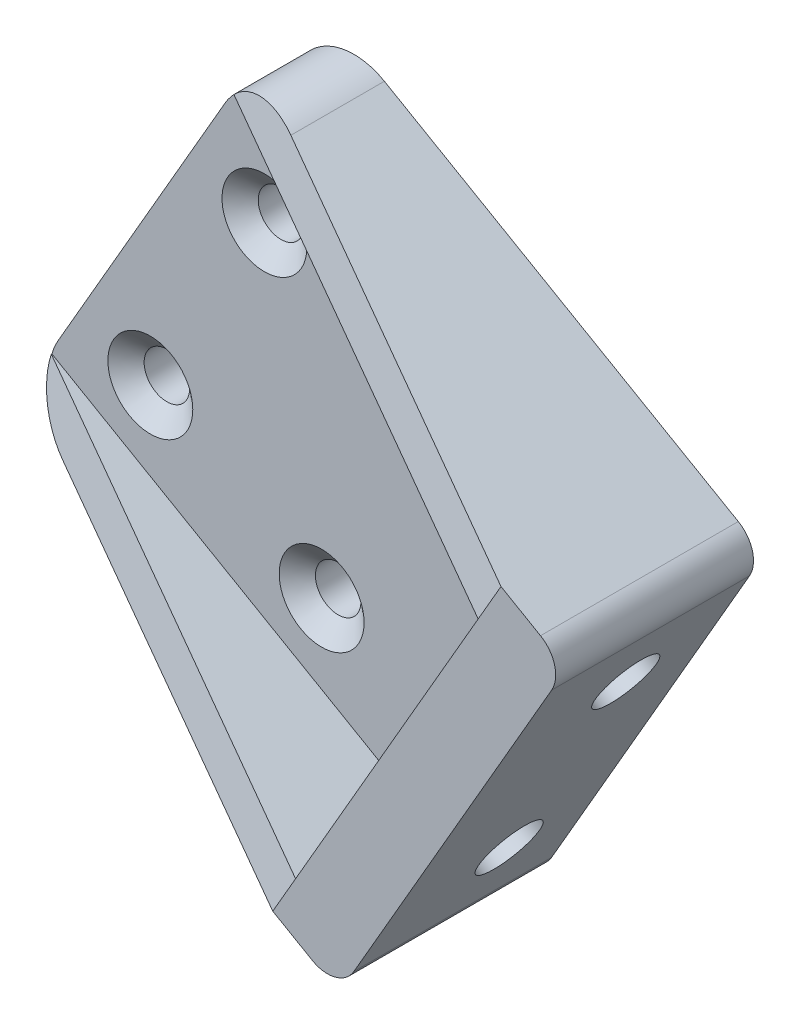
ISO-10303-21;
HEADER;
FILE_DESCRIPTION(('STEP AP214'),'2;1');
FILE_NAME('part.step','',(''),(''),'','','');
FILE_SCHEMA(('AUTOMOTIVE_DESIGN { 1 0 10303 214 1 1 1 1 }'));
ENDSEC;
DATA;
#1=APPLICATION_CONTEXT('core data for automotive mechanical design processes');
#2=APPLICATION_PROTOCOL_DEFINITION('international standard','automotive_design',2000,#1);
#3=PRODUCT_CONTEXT('',#1,'mechanical');
#4=PRODUCT('Part','Part','',(#3));
#5=PRODUCT_RELATED_PRODUCT_CATEGORY('part','',(#4));
#6=PRODUCT_DEFINITION_FORMATION('','',#4);
#7=PRODUCT_DEFINITION_CONTEXT('part definition',#1,'design');
#8=PRODUCT_DEFINITION('design','',#6,#7);
#9=PRODUCT_DEFINITION_SHAPE('','',#8);
#10=(LENGTH_UNIT() NAMED_UNIT(*) SI_UNIT(.MILLI.,.METRE.));
#11=(NAMED_UNIT(*) PLANE_ANGLE_UNIT() SI_UNIT($,.RADIAN.));
#12=(NAMED_UNIT(*) SI_UNIT($,.STERADIAN.) SOLID_ANGLE_UNIT());
#13=UNCERTAINTY_MEASURE_WITH_UNIT(LENGTH_MEASURE(1.E-05),#10,'distance_accuracy_value','');
#14=(GEOMETRIC_REPRESENTATION_CONTEXT(3) GLOBAL_UNCERTAINTY_ASSIGNED_CONTEXT((#13)) GLOBAL_UNIT_ASSIGNED_CONTEXT((#10,
#11,#12)) REPRESENTATION_CONTEXT('',''));
#15=CARTESIAN_POINT('',(0.,0.,0.));
#16=DIRECTION('',(0.,0.,1.));
#17=DIRECTION('',(1.,0.,0.));
#18=AXIS2_PLACEMENT_3D('',#15,#16,#17);
#19=CARTESIAN_POINT('',(49.669607592428,-6.67971605790583,6.35));
#20=DIRECTION('',(0.866025403784439,-0.499999999999999,0.));
#21=DIRECTION('',(0.5,0.866025403784439,0.));
#22=AXIS2_PLACEMENT_3D('',#19,#20,#21);
#23=PLANE('',#22);
#24=DIRECTION('',(-0.499999999999999,-0.866025403784439,0.));
#25=VECTOR('',#24,1.);
#26=CARTESIAN_POINT('',(49.669607592428,-6.67971605790583,6.35));
#27=LINE('',#26,#25);
#28=CARTESIAN_POINT('',(47.129607592428,-11.0791251091308,6.35));
#29=VERTEX_POINT('',#28);
#30=CARTESIAN_POINT('',(33.159607592428,-35.275874890868,6.35));
#31=VERTEX_POINT('',#30);
#32=EDGE_CURVE('E250',#29,#31,#27,.T.);
#33=ORIENTED_EDGE('',*,*,#32,.F.);
#34=DIRECTION('',(0.,0.,-1.));
#35=VECTOR('',#34,1.);
#36=CARTESIAN_POINT('',(47.129607592428,-11.0791251091308,6.35));
#37=LINE('',#36,#35);
#38=CARTESIAN_POINT('',(47.129607592428,-11.0791251091308,0.));
#39=VERTEX_POINT('',#38);
#40=EDGE_CURVE('E184',#29,#39,#37,.T.);
#41=ORIENTED_EDGE('',*,*,#40,.T.);
#42=DIRECTION('',(-0.499999999999999,-0.866025403784439,0.));
#43=VECTOR('',#42,1.);
#44=CARTESIAN_POINT('',(49.669607592428,-6.67971605790583,0.));
#45=LINE('',#44,#43);
#46=CARTESIAN_POINT('',(33.159607592428,-35.275874890868,0.));
#47=VERTEX_POINT('',#46);
#48=EDGE_CURVE('E252',#39,#47,#45,.T.);
#49=ORIENTED_EDGE('',*,*,#48,.T.);
#50=DIRECTION('',(0.,0.,-1.));
#51=VECTOR('',#50,1.);
#52=CARTESIAN_POINT('',(33.159607592428,-35.275874890868,6.35));
#53=LINE('',#52,#51);
#54=EDGE_CURVE('E179',#47,#31,#53,.F.);
#55=ORIENTED_EDGE('',*,*,#54,.T.);
#56=EDGE_LOOP('',(#33,#41,#49,#55));
#57=FACE_BOUND('',#56,.T.);
#58=ADVANCED_FACE('F33',(#57),#23,.F.);
#59=CARTESIAN_POINT('',(30.619607592428,-39.675283942093,6.35));
#60=DIRECTION('',(0.5,0.866025403784439,0.));
#61=DIRECTION('',(-0.866025403784439,0.5,0.));
#62=AXIS2_PLACEMENT_3D('',#59,#60,#61);
#63=PLANE('',#62);
#64=DIRECTION('',(0.866025403784439,-0.5,0.));
#65=VECTOR('',#64,1.);
#66=CARTESIAN_POINT('',(30.619607592428,-39.675283942093,0.));
#67=LINE('',#66,#65);
#68=CARTESIAN_POINT('',(35.019016643653,-42.215283942093,0.));
#69=VERTEX_POINT('',#68);
#70=CARTESIAN_POINT('',(64.5610484226282,-59.2713839420928,0.));
#71=VERTEX_POINT('',#70);
#72=EDGE_CURVE('E248',#69,#71,#67,.T.);
#73=ORIENTED_EDGE('',*,*,#72,.T.);
#74=DIRECTION('',(0.,0.,-1.));
#75=VECTOR('',#74,1.);
#76=CARTESIAN_POINT('',(64.5610484226282,-59.2713839420928,6.35));
#77=LINE('',#76,#75);
#78=CARTESIAN_POINT('',(64.5610484226282,-59.2713839420928,16.51));
#79=VERTEX_POINT('',#78);
#80=EDGE_CURVE('E11',#71,#79,#77,.F.);
#81=ORIENTED_EDGE('',*,*,#80,.T.);
#82=DIRECTION('',(0.86602540378444,-0.499999999999998,0.));
#83=VECTOR('',#82,1.);
#84=CARTESIAN_POINT('',(61.2614916342095,-57.3663839420928,16.51));
#85=LINE('',#84,#83);
#86=CARTESIAN_POINT('',(61.2614916342095,-57.3663839420928,16.51));
#87=VERTEX_POINT('',#86);
#88=EDGE_CURVE('E348',#87,#79,#85,.T.);
#89=ORIENTED_EDGE('',*,*,#88,.F.);
#90=DIRECTION('',(0.832387744943736,-0.480579288613411,0.275996719950274));
#91=VECTOR('',#90,1.);
#92=CARTESIAN_POINT('',(30.6196075924273,-39.6752839420942,6.35));
#93=LINE('',#92,#91);
#94=CARTESIAN_POINT('',(35.0190166436523,-42.2152839420942,7.80872218234029));
#95=VERTEX_POINT('',#94);
#96=EDGE_CURVE('E364',#95,#87,#93,.T.);
#97=ORIENTED_EDGE('',*,*,#96,.F.);
#98=DIRECTION('',(0.,0.,-1.));
#99=VECTOR('',#98,1.);
#100=CARTESIAN_POINT('',(35.019016643653,-42.215283942093,6.35));
#101=LINE('',#100,#99);
#102=EDGE_CURVE('E202',#95,#69,#101,.T.);
#103=ORIENTED_EDGE('',*,*,#102,.T.);
#104=EDGE_LOOP('',(#73,#81,#89,#97,#103));
#105=FACE_BOUND('',#104,.T.);
#106=ADVANCED_FACE('F321',(#105),#63,.F.);
#107=CARTESIAN_POINT('',(85.8107529482407,-27.5458160579057,6.35));
#108=DIRECTION('',(-0.866025403784439,0.5,0.));
#109=DIRECTION('',(-0.5,-0.866025403784439,0.));
#110=AXIS2_PLACEMENT_3D('',#107,#108,#109);
#111=PLANE('',#110);
#112=CARTESIAN_POINT('',(81.1522967470904,-35.6144988831323,6.93730614945245));
#113=DIRECTION('',(0.866025403784438,-0.5,0.));
#114=DIRECTION('',(0.5,0.866025403784438,0.));
#115=AXIS2_PLACEMENT_3D('',#112,#113,#114);
#116=CIRCLE('',#115,2.54999999999999);
#117=CARTESIAN_POINT('',(82.4272967470904,-33.406134103482,6.93730614945245));
#118=VERTEX_POINT('',#117);
#119=EDGE_CURVE('E170',#118,#118,#116,.T.);
#120=ORIENTED_EDGE('',*,*,#119,.F.);
#121=EDGE_LOOP('',(#120));
#122=FACE_BOUND('',#121,.T.);
#123=CARTESIAN_POINT('',(71.4192091493911,-52.472701116866,6.93730614945245));
#124=DIRECTION('',(0.866025403784438,-0.5,0.));
#125=DIRECTION('',(0.5,0.866025403784438,0.));
#126=AXIS2_PLACEMENT_3D('',#123,#124,#125);
#127=CIRCLE('',#126,2.54999999999999);
#128=CARTESIAN_POINT('',(72.6942091493911,-50.2643363372157,6.93730614945245));
#129=VERTEX_POINT('',#128);
#130=EDGE_CURVE('E169',#129,#129,#127,.T.);
#131=ORIENTED_EDGE('',*,*,#130,.F.);
#132=EDGE_LOOP('',(#131));
#133=FACE_BOUND('',#132,.T.);
#134=DIRECTION('',(0.5,0.866025403784439,0.));
#135=VECTOR('',#134,1.);
#136=CARTESIAN_POINT('',(85.8107529482407,-27.5458160579057,0.));
#137=LINE('',#136,#135);
#138=CARTESIAN_POINT('',(68.0307529482407,-58.3416794164803,0.));
#139=VERTEX_POINT('',#138);
#140=CARTESIAN_POINT('',(84.5407529482407,-29.7455205835181,0.));
#141=VERTEX_POINT('',#140);
#142=EDGE_CURVE('E244',#139,#141,#137,.T.);
#143=ORIENTED_EDGE('',*,*,#142,.T.);
#144=DIRECTION('',(0.,0.,-1.));
#145=VECTOR('',#144,1.);
#146=CARTESIAN_POINT('',(84.5407529482407,-29.7455205835181,6.35));
#147=LINE('',#146,#145);
#148=CARTESIAN_POINT('',(84.5407529482407,-29.7455205835181,16.51));
#149=VERTEX_POINT('',#148);
#150=EDGE_CURVE('E54',#141,#149,#147,.F.);
#151=ORIENTED_EDGE('',*,*,#150,.T.);
#152=DIRECTION('',(0.5,0.866025403784439,0.));
#153=VECTOR('',#152,1.);
#154=CARTESIAN_POINT('',(66.7607529482407,-60.5413839420928,16.51));
#155=LINE('',#154,#153);
#156=CARTESIAN_POINT('',(68.0307529482407,-58.3416794164803,16.51));
#157=VERTEX_POINT('',#156);
#158=EDGE_CURVE('E228',#157,#149,#155,.T.);
#159=ORIENTED_EDGE('',*,*,#158,.F.);
#160=DIRECTION('',(0.,0.,-1.));
#161=VECTOR('',#160,1.);
#162=CARTESIAN_POINT('',(68.0307529482407,-58.3416794164803,6.35));
#163=LINE('',#162,#161);
#164=EDGE_CURVE('E216',#157,#139,#163,.T.);
#165=ORIENTED_EDGE('',*,*,#164,.T.);
#166=EDGE_LOOP('',(#143,#151,#159,#165));
#167=FACE_BOUND('',#166,.T.);
#168=ADVANCED_FACE('F246',(#122,#133,#167),#111,.F.);
#169=CARTESIAN_POINT('',(49.669607592428,-6.67971605790583,6.35));
#170=DIRECTION('',(-0.5,-0.866025403784439,0.));
#171=DIRECTION('',(0.866025403784439,-0.5,0.));
#172=AXIS2_PLACEMENT_3D('',#169,#170,#171);
#173=PLANE('',#172);
#174=DIRECTION('',(-0.866025403784439,0.5,0.));
#175=VECTOR('',#174,1.);
#176=CARTESIAN_POINT('',(85.8107529482407,-27.5458160579057,16.51));
#177=LINE('',#176,#175);
#178=CARTESIAN_POINT('',(83.6110484226282,-26.2758160579057,16.51));
#179=VERTEX_POINT('',#178);
#180=CARTESIAN_POINT('',(80.3114916342095,-24.3708160579057,16.51));
#181=VERTEX_POINT('',#180);
#182=EDGE_CURVE('E226',#179,#181,#177,.T.);
#183=ORIENTED_EDGE('',*,*,#182,.F.);
#184=DIRECTION('',(0.,0.,-1.));
#185=VECTOR('',#184,1.);
#186=CARTESIAN_POINT('',(83.6110484226282,-26.2758160579057,6.35));
#187=LINE('',#186,#185);
#188=CARTESIAN_POINT('',(83.6110484226282,-26.2758160579057,0.));
#189=VERTEX_POINT('',#188);
#190=EDGE_CURVE('E209',#179,#189,#187,.T.);
#191=ORIENTED_EDGE('',*,*,#190,.T.);
#192=DIRECTION('',(-0.866025403784439,0.5,0.));
#193=VECTOR('',#192,1.);
#194=CARTESIAN_POINT('',(49.669607592428,-6.67971605790583,0.));
#195=LINE('',#194,#193);
#196=CARTESIAN_POINT('',(54.069016643653,-9.21971605790583,0.));
#197=VERTEX_POINT('',#196);
#198=EDGE_CURVE('E245',#189,#197,#195,.T.);
#199=ORIENTED_EDGE('',*,*,#198,.T.);
#200=DIRECTION('',(0.,0.,-1.));
#201=VECTOR('',#200,1.);
#202=CARTESIAN_POINT('',(54.069016643653,-9.21971605790583,6.35));
#203=LINE('',#202,#201);
#204=CARTESIAN_POINT('',(54.069016643653,-9.21971605790582,7.80872218234029));
#205=VERTEX_POINT('',#204);
#206=EDGE_CURVE('E192',#197,#205,#203,.F.);
#207=ORIENTED_EDGE('',*,*,#206,.T.);
#208=DIRECTION('',(0.832387744943736,-0.480579288613411,0.275996719950274));
#209=VECTOR('',#208,1.);
#210=CARTESIAN_POINT('',(49.669607592428,-6.67971605790581,6.35));
#211=LINE('',#210,#209);
#212=EDGE_CURVE('E235',#205,#181,#211,.T.);
#213=ORIENTED_EDGE('',*,*,#212,.T.);
#214=EDGE_LOOP('',(#183,#191,#199,#207,#213));
#215=FACE_BOUND('',#214,.T.);
#216=ADVANCED_FACE('F232',(#215),#173,.F.);
#217=CARTESIAN_POINT('',(0.,0.,6.35));
#218=DIRECTION('',(0.,0.,1.));
#219=DIRECTION('',(1.,0.,0.));
#220=AXIS2_PLACEMENT_3D('',#217,#218,#219);
#221=PLANE('',#220);
#222=CARTESIAN_POINT('',(40.8813689064592,-34.6013919710462,6.35));
#223=DIRECTION('',(0.,0.,1.));
#224=DIRECTION('',(1.,0.,0.));
#225=AXIS2_PLACEMENT_3D('',#222,#223,#224);
#226=CIRCLE('',#225,3.5433);
#227=CARTESIAN_POINT('',(44.4246689064592,-34.6013919710462,6.35));
#228=VERTEX_POINT('',#227);
#229=EDGE_CURVE('E412',#228,#228,#226,.T.);
#230=ORIENTED_EDGE('',*,*,#229,.F.);
#231=EDGE_LOOP('',(#230));
#232=FACE_BOUND('',#231,.T.);
#233=CARTESIAN_POINT('',(50.4063689064592,-18.1036080289526,6.35));
#234=DIRECTION('',(0.,0.,1.));
#235=DIRECTION('',(1.,0.,0.));
#236=AXIS2_PLACEMENT_3D('',#233,#234,#235);
#237=CIRCLE('',#236,3.5433);
#238=CARTESIAN_POINT('',(53.9496689064592,-18.1036080289526,6.35));
#239=VERTEX_POINT('',#238);
#240=EDGE_CURVE('E403',#239,#239,#237,.T.);
#241=ORIENTED_EDGE('',*,*,#240,.F.);
#242=EDGE_LOOP('',(#241));
#243=FACE_BOUND('',#242,.T.);
#244=CARTESIAN_POINT('',(64.7044483229403,-26.3586080289526,6.35));
#245=DIRECTION('',(0.,0.,1.));
#246=DIRECTION('',(1.,0.,0.));
#247=AXIS2_PLACEMENT_3D('',#244,#245,#246);
#248=CIRCLE('',#247,3.5433);
#249=CARTESIAN_POINT('',(68.2477483229403,-26.3586080289526,6.35));
#250=VERTEX_POINT('',#249);
#251=EDGE_CURVE('E394',#250,#250,#248,.T.);
#252=ORIENTED_EDGE('',*,*,#251,.F.);
#253=EDGE_LOOP('',(#252));
#254=FACE_BOUND('',#253,.T.);
#255=CARTESIAN_POINT('',(55.1794483229403,-42.8563919710462,6.35));
#256=DIRECTION('',(0.,0.,1.));
#257=DIRECTION('',(1.,0.,0.));
#258=AXIS2_PLACEMENT_3D('',#255,#256,#257);
#259=CIRCLE('',#258,3.5433);
#260=CARTESIAN_POINT('',(58.7227483229403,-42.8563919710462,6.35));
#261=VERTEX_POINT('',#260);
#262=EDGE_CURVE('E385',#261,#261,#259,.T.);
#263=ORIENTED_EDGE('',*,*,#262,.F.);
#264=EDGE_LOOP('',(#263));
#265=FACE_BOUND('',#264,.T.);
#266=DIRECTION('',(-0.866025403784439,0.5,0.));
#267=VECTOR('',#266,1.);
#268=CARTESIAN_POINT('',(78.4064916342095,-27.6703728463244,6.35));
#269=LINE('',#268,#267);
#270=CARTESIAN_POINT('',(78.4064916342095,-27.6703728463244,6.35));
#271=VERTEX_POINT('',#270);
#272=CARTESIAN_POINT('',(47.9043071465159,-10.0599284214828,6.35));
#273=VERTEX_POINT('',#272);
#274=EDGE_CURVE('E354',#271,#273,#269,.T.);
#275=ORIENTED_EDGE('',*,*,#274,.T.);
#276=CARTESIAN_POINT('',(51.529016643653,-13.6191251091308,6.35));
#277=DIRECTION('',(0.,0.,1.));
#278=DIRECTION('',(1.,0.,0.));
#279=AXIS2_PLACEMENT_3D('',#276,#277,#278);
#280=CIRCLE('',#279,5.08);
#281=EDGE_CURVE('E200',#273,#29,#280,.T.);
#282=ORIENTED_EDGE('',*,*,#281,.T.);
#283=ORIENTED_EDGE('',*,*,#32,.T.);
#284=CARTESIAN_POINT('',(37.559016643653,-37.815874890868,6.35));
#285=DIRECTION('',(0.,0.,1.));
#286=DIRECTION('',(1.,0.,0.));
#287=AXIS2_PLACEMENT_3D('',#284,#285,#286);
#288=CIRCLE('',#287,5.08);
#289=CARTESIAN_POINT('',(32.6643071465155,-36.456382728834,6.35));
#290=VERTEX_POINT('',#289);
#291=EDGE_CURVE('E198',#31,#290,#288,.T.);
#292=ORIENTED_EDGE('',*,*,#291,.T.);
#293=DIRECTION('',(-0.866025403784439,0.499999999999999,0.));
#294=VECTOR('',#293,1.);
#295=CARTESIAN_POINT('',(63.1664916342088,-54.0668271536753,6.35));
#296=LINE('',#295,#294);
#297=CARTESIAN_POINT('',(63.1664916342088,-54.0668271536753,6.35));
#298=VERTEX_POINT('',#297);
#299=EDGE_CURVE('E366',#298,#290,#296,.T.);
#300=ORIENTED_EDGE('',*,*,#299,.F.);
#301=DIRECTION('',(-0.5,-0.866025403784439,0.));
#302=VECTOR('',#301,1.);
#303=CARTESIAN_POINT('',(80.3114916342095,-24.3708160579057,6.35));
#304=LINE('',#303,#302);
#305=CARTESIAN_POINT('',(64.6792251138368,-51.4466959086492,6.35));
#306=VERTEX_POINT('',#305);
#307=EDGE_CURVE('E259',#306,#298,#304,.T.);
#308=ORIENTED_EDGE('',*,*,#307,.F.);
#309=DIRECTION('',(0.866025403784438,-0.5,0.));
#310=VECTOR('',#309,1.);
#311=CARTESIAN_POINT('',(70.178486427868,-54.6216959086492,6.35));
#312=LINE('',#311,#310);
#313=CARTESIAN_POINT('',(63.139431945908,-50.5576959086492,6.35));
#314=VERTEX_POINT('',#313);
#315=EDGE_CURVE('E454',#314,#306,#312,.T.);
#316=ORIENTED_EDGE('',*,*,#315,.F.);
#317=CARTESIAN_POINT('',(63.1645679482118,-52.8922918588002,6.35));
#318=CARTESIAN_POINT('',(63.1616679257406,-52.6800356568973,6.35));
#319=CARTESIAN_POINT('',(63.1588418076062,-52.4677782200947,6.35));
#320=CARTESIAN_POINT('',(63.1534756416226,-52.0432536983283,6.35));
#321=CARTESIAN_POINT('',(63.1509356019462,-51.8309866132622,6.35));
#322=CARTESIAN_POINT('',(63.1462735163987,-51.4058532261958,6.35));
#323=CARTESIAN_POINT('',(63.1441526611504,-51.1929869110068,6.35));
#324=CARTESIAN_POINT('',(63.1406152358189,-50.7672520545871,6.35));
#325=CARTESIAN_POINT('',(63.1391986511281,-50.5543835134941,6.35));
#326=CARTESIAN_POINT('',(63.1380519571835,-50.2302987364304,6.35));
#327=CARTESIAN_POINT('',(63.1378395281479,-50.1190843446111,6.35));
#328=CARTESIAN_POINT('',(63.1379532662041,-49.896650850708,6.35));
#329=CARTESIAN_POINT('',(63.1382794549127,-49.7854317486143,6.35));
#330=CARTESIAN_POINT('',(63.1397596180906,-49.563170276895,6.35));
#331=CARTESIAN_POINT('',(63.140912315456,-49.4521278991772,6.35));
#332=CARTESIAN_POINT('',(63.1445590952118,-49.230071083183,6.35));
#333=CARTESIAN_POINT('',(63.147053044837,-49.1190566432292,6.35));
#334=CARTESIAN_POINT('',(63.1528125250689,-48.9473836643378,6.35));
#335=CARTESIAN_POINT('',(63.1552166184551,-48.8866972206919,6.35));
#336=CARTESIAN_POINT('',(63.1611082694497,-48.7653772306634,6.35));
#337=CARTESIAN_POINT('',(63.1645957642583,-48.7047436814189,6.35));
#338=CARTESIAN_POINT('',(63.1732237397579,-48.5832872684547,6.35));
#339=CARTESIAN_POINT('',(63.1783723664431,-48.5224649658429,6.35));
#340=CARTESIAN_POINT('',(63.1912619461898,-48.4010907034475,6.35));
#341=CARTESIAN_POINT('',(63.199001936221,-48.3405386516891,6.35));
#342=CARTESIAN_POINT('',(63.2146262829362,-48.2453274617159,6.35));
#343=CARTESIAN_POINT('',(63.2210936980291,-48.2104408242378,6.35));
#344=CARTESIAN_POINT('',(63.2359774482342,-48.1410679476839,6.35));
#345=CARTESIAN_POINT('',(63.2443941144869,-48.1065817776865,6.35));
#346=CARTESIAN_POINT('',(63.2636452142718,-48.0387180704494,6.35));
#347=CARTESIAN_POINT('',(63.274449616812,-48.0053322166489,6.35));
#348=CARTESIAN_POINT('',(63.2990797944048,-47.9397078819447,6.35));
#349=CARTESIAN_POINT('',(63.3129028394686,-47.9074683947323,6.35));
#350=CARTESIAN_POINT('',(63.3441276349603,-47.8441366271014,6.35));
#351=CARTESIAN_POINT('',(63.3615814285247,-47.8130698018702,6.35));
#352=CARTESIAN_POINT('',(63.3997706641609,-47.7530267676438,6.35));
#353=CARTESIAN_POINT('',(63.4205065881184,-47.7240508665512,6.35));
#354=CARTESIAN_POINT('',(63.464943796009,-47.6679141851395,6.35));
#355=CARTESIAN_POINT('',(63.4886783410867,-47.6407800367338,6.35));
#356=CARTESIAN_POINT('',(63.5382004409967,-47.5884644859748,6.35));
#357=CARTESIAN_POINT('',(63.5639887523087,-47.5632838099642,6.35));
#358=CARTESIAN_POINT('',(63.6341220344498,-47.4987363368604,6.35));
#359=CARTESIAN_POINT('',(63.6796922777454,-47.4607141696201,6.35));
#360=CARTESIAN_POINT('',(63.7729995039603,-47.387402760729,6.35));
#361=CARTESIAN_POINT('',(63.8207388169422,-47.3521165737415,6.35));
#362=CARTESIAN_POINT('',(63.9175892072953,-47.2832347791605,6.35));
#363=CARTESIAN_POINT('',(63.9667033558369,-47.2496435202203,6.35));
#364=CARTESIAN_POINT('',(64.0657163069662,-47.1836331372578,6.35));
#365=CARTESIAN_POINT('',(64.1156152201987,-47.1512141806844,6.35));
#366=CARTESIAN_POINT('',(64.2163360176048,-47.0869150591158,6.35));
#367=CARTESIAN_POINT('',(64.2671621177585,-47.0550415213311,6.35));
#368=CARTESIAN_POINT('',(64.3691713551072,-46.9918700323968,6.35));
#369=CARTESIAN_POINT('',(64.4203545010947,-46.9605720954913,6.35));
#370=CARTESIAN_POINT('',(64.5740828184515,-46.8674131570285,6.35));
#371=CARTESIAN_POINT('',(64.6769994209463,-46.8061660850304,6.35));
#372=CARTESIAN_POINT('',(64.8842948721009,-46.684053073641,6.35));
#373=CARTESIAN_POINT('',(64.988678572026,-46.6231954200164,6.35));
#374=CARTESIAN_POINT('',(65.1977888045687,-46.5020719522689,6.35));
#375=CARTESIAN_POINT('',(65.3025153378479,-46.4418061392891,6.35));
#376=CARTESIAN_POINT('',(65.6170294995595,-46.2615732613319,6.35));
#377=CARTESIAN_POINT('',(65.827143047241,-46.1421757934863,6.35));
#378=CARTESIAN_POINT('',(66.247983289,-45.9040133236811,6.35));
#379=CARTESIAN_POINT('',(66.4587103701676,-45.7852490078038,6.35));
#380=CARTESIAN_POINT('',(66.8804046416881,-45.5481568690134,6.35));
#381=CARTESIAN_POINT('',(67.0913718273931,-45.4298290378328,6.35));
#382=CARTESIAN_POINT('',(67.5025236710956,-45.1995647365571,6.35));
#383=CARTESIAN_POINT('',(67.7027007470112,-45.0876147178771,6.35));
#384=CARTESIAN_POINT('',(68.1031480656295,-44.8638785026561,6.35));
#385=CARTESIAN_POINT('',(68.3034183089074,-44.7520923071446,6.35));
#386=CARTESIAN_POINT('',(68.7038259869741,-44.5287455963542,6.35));
#387=CARTESIAN_POINT('',(68.9039633582794,-44.4171849672382,6.35));
#388=CARTESIAN_POINT('',(69.3042850612554,-44.1941511322993,6.35));
#389=CARTESIAN_POINT('',(69.5044693926043,-44.0826779258983,6.35));
#390=CARTESIAN_POINT('',(69.70466984041,-43.9712336972768,6.35));
#391=B_SPLINE_CURVE_WITH_KNOTS('',3,(#317,#318,#319,#320,#321,#322,#323,#324,#325,#326,#327,
#328,#329,#330,#331,#332,#333,#334,#335,#336,#337,#338,#339,#340,#341,#342,#343,#344,#345,#346,
#347,#348,#349,#350,#351,#352,#353,#354,#355,#356,#357,#358,#359,#360,#361,#362,#363,#364,#365,
#366,#367,#368,#369,#370,#371,#372,#373,#374,#375,#376,#377,#378,#379,#380,#381,#382,#383,#384,
#385,#386,#387,#388,#389,#390),.UNSPECIFIED.,.F.,.F.,(4,2,2,2,2,2,2,2,2,2,2,2,2,2,2,2,2,2,2,2,2,
2,2,2,2,2,2,2,2,2,2,2,2,2,2,2,4),(0.,0.636828391658414,1.2736749714507,1.91230520213641,
2.55092218605637,2.88456524430546,3.21822169329645,3.55136369128016,3.88447271891319,
4.06666905693756,4.24885483584831,4.4319479692541,4.61497313500494,4.72137671325213,
4.8277983807098,4.93295087956534,5.03800867195071,5.14469133191383,5.25138966968355,
5.35939711054273,5.46744452028121,5.64529388434284,5.82333903667302,6.00181991504847,
6.18032618731256,6.36030108771864,6.54028043584815,6.89955707878789,7.26204160199088,
7.62452682519612,8.34952727931354,9.07519741707682,9.80085373851979,10.4889183480789,
11.1769872626788,11.8643784482621,12.551765050061),.UNSPECIFIED.);
#392=CARTESIAN_POINT('',(65.6208773889544,-46.2597063250827,6.35));
#393=VERTEX_POINT('',#392);
#394=EDGE_CURVE('E287',#393,#314,#391,.F.);
#395=ORIENTED_EDGE('',*,*,#394,.F.);
#396=DIRECTION('',(0.866025403784438,-0.5,0.));
#397=VECTOR('',#396,1.);
#398=CARTESIAN_POINT('',(72.6599318709143,-50.3237063250827,6.35));
#399=LINE('',#398,#397);
#400=CARTESIAN_POINT('',(67.1606705568831,-47.1487063250828,6.35));
#401=VERTEX_POINT('',#400);
#402=EDGE_CURVE('E293',#401,#393,#399,.F.);
#403=ORIENTED_EDGE('',*,*,#402,.F.);
#404=CARTESIAN_POINT('',(74.4123127115361,-34.5884936749155,6.35));
#405=VERTEX_POINT('',#404);
#406=EDGE_CURVE('E176',#405,#401,#304,.T.);
#407=ORIENTED_EDGE('',*,*,#406,.F.);
#408=DIRECTION('',(0.866025403784438,-0.5,0.));
#409=VECTOR('',#408,1.);
#410=CARTESIAN_POINT('',(79.9115740255673,-37.7634936749155,6.35));
#411=LINE('',#410,#409);
#412=CARTESIAN_POINT('',(72.8725195436074,-33.6994936749155,6.35));
#413=VERTEX_POINT('',#412);
#414=EDGE_CURVE('E167',#413,#405,#411,.T.);
#415=ORIENTED_EDGE('',*,*,#414,.F.);
#416=CARTESIAN_POINT('',(72.8976555459111,-36.0340896250665,6.35));
#417=CARTESIAN_POINT('',(72.89475552344,-35.8218334231636,6.35));
#418=CARTESIAN_POINT('',(72.8919294053055,-35.6095759863609,6.35));
#419=CARTESIAN_POINT('',(72.886563239322,-35.1850514645946,6.35));
#420=CARTESIAN_POINT('',(72.8840231996455,-34.9727843795285,6.35));
#421=CARTESIAN_POINT('',(72.879361114098,-34.547650992462,6.35));
#422=CARTESIAN_POINT('',(72.8772402588497,-34.3347846772731,6.35));
#423=CARTESIAN_POINT('',(72.8737028335182,-33.9090498208534,6.35));
#424=CARTESIAN_POINT('',(72.8722862488274,-33.6961812797603,6.35));
#425=CARTESIAN_POINT('',(72.8711395548828,-33.3720965026967,6.35));
#426=CARTESIAN_POINT('',(72.8709271258472,-33.2608821108774,6.35));
#427=CARTESIAN_POINT('',(72.8710408639034,-33.0384486169743,6.35));
#428=CARTESIAN_POINT('',(72.871367052612,-32.9272295148806,6.35));
#429=CARTESIAN_POINT('',(72.8728472157899,-32.7049680431613,6.35));
#430=CARTESIAN_POINT('',(72.8739999131553,-32.5939256654434,6.35));
#431=CARTESIAN_POINT('',(72.8776466929112,-32.3718688494493,6.35));
#432=CARTESIAN_POINT('',(72.8801406425364,-32.2608544094954,6.35));
#433=CARTESIAN_POINT('',(72.8859001227682,-32.0891814306041,6.35));
#434=CARTESIAN_POINT('',(72.8883042161545,-32.0284949869582,6.35));
#435=CARTESIAN_POINT('',(72.8941958671491,-31.9071749969297,6.35));
#436=CARTESIAN_POINT('',(72.8976833619576,-31.8465414476852,6.35));
#437=CARTESIAN_POINT('',(72.9063113374572,-31.7250850347209,6.35));
#438=CARTESIAN_POINT('',(72.9114599641424,-31.6642627321091,6.35));
#439=CARTESIAN_POINT('',(72.9243495438891,-31.5428884697138,6.35));
#440=CARTESIAN_POINT('',(72.9320895339203,-31.4823364179553,6.35));
#441=CARTESIAN_POINT('',(72.9477138806355,-31.3871252279822,6.35));
#442=CARTESIAN_POINT('',(72.9541812957284,-31.352238590504,6.35));
#443=CARTESIAN_POINT('',(72.9690650459335,-31.2828657139502,6.35));
#444=CARTESIAN_POINT('',(72.9774817121862,-31.2483795439528,6.35));
#445=CARTESIAN_POINT('',(72.9967328119711,-31.1805158367157,6.35));
#446=CARTESIAN_POINT('',(73.0075372145114,-31.1471299829152,6.35));
#447=CARTESIAN_POINT('',(73.0321673921041,-31.081505648211,6.35));
#448=CARTESIAN_POINT('',(73.045990437168,-31.0492661609985,6.35));
#449=CARTESIAN_POINT('',(73.0772152326596,-30.9859343933677,6.35));
#450=CARTESIAN_POINT('',(73.094669026224,-30.9548675681364,6.35));
#451=CARTESIAN_POINT('',(73.1328582618602,-30.8948245339101,6.35));
#452=CARTESIAN_POINT('',(73.1535941858177,-30.8658486328175,6.35));
#453=CARTESIAN_POINT('',(73.1980313937083,-30.8097119514058,6.35));
#454=CARTESIAN_POINT('',(73.2217659387861,-30.782577803,6.35));
#455=CARTESIAN_POINT('',(73.2712880386961,-30.7302622522411,6.35));
#456=CARTESIAN_POINT('',(73.2970763500081,-30.7050815762305,6.35));
#457=CARTESIAN_POINT('',(73.3672096321491,-30.6405341031267,6.35));
#458=CARTESIAN_POINT('',(73.4127798754448,-30.6025119358864,6.35));
#459=CARTESIAN_POINT('',(73.5060871016597,-30.5292005269952,6.35));
#460=CARTESIAN_POINT('',(73.5538264146416,-30.4939143400078,6.35));
#461=CARTESIAN_POINT('',(73.6506768049946,-30.4250325454268,6.35));
#462=CARTESIAN_POINT('',(73.6997909535362,-30.3914412864866,6.35));
#463=CARTESIAN_POINT('',(73.7988039046655,-30.3254309035241,6.35));
#464=CARTESIAN_POINT('',(73.848702817898,-30.2930119469506,6.35));
#465=CARTESIAN_POINT('',(73.9494236153042,-30.2287128253821,6.35));
#466=CARTESIAN_POINT('',(74.0002497154579,-30.1968392875973,6.35));
#467=CARTESIAN_POINT('',(74.1022589528066,-30.1336677986631,6.35));
#468=CARTESIAN_POINT('',(74.1534420987941,-30.1023698617576,6.35));
#469=CARTESIAN_POINT('',(74.3071704161509,-30.0092109232948,6.35));
#470=CARTESIAN_POINT('',(74.4100870186456,-29.9479638512967,6.35));
#471=CARTESIAN_POINT('',(74.6173824698003,-29.8258508399072,6.35));
#472=CARTESIAN_POINT('',(74.7217661697254,-29.7649931862827,6.35));
#473=CARTESIAN_POINT('',(74.9308764022681,-29.6438697185351,6.35));
#474=CARTESIAN_POINT('',(75.0356029355473,-29.5836039055553,6.35));
#475=CARTESIAN_POINT('',(75.350117097259,-29.4033710275981,6.35));
#476=CARTESIAN_POINT('',(75.5602306449405,-29.2839735597525,6.35));
#477=CARTESIAN_POINT('',(75.9810708866994,-29.0458110899474,6.35));
#478=CARTESIAN_POINT('',(76.191797967867,-28.92704677407,6.35));
#479=CARTESIAN_POINT('',(76.6134922393875,-28.6899546352796,6.35));
#480=CARTESIAN_POINT('',(76.8244594250926,-28.5716268040991,6.35));
#481=CARTESIAN_POINT('',(77.2356112687951,-28.3413625028233,6.35));
#482=CARTESIAN_POINT('',(77.4357883447107,-28.2294124841433,6.35));
#483=CARTESIAN_POINT('',(77.836235663329,-28.0056762689223,6.35));
#484=CARTESIAN_POINT('',(78.0365059066069,-27.8938900734108,6.35));
#485=CARTESIAN_POINT('',(78.4369135846736,-27.6705433626203,6.35));
#486=CARTESIAN_POINT('',(78.6370509559788,-27.5589827335043,6.35));
#487=CARTESIAN_POINT('',(79.037372658955,-27.3359488985654,6.35));
#488=CARTESIAN_POINT('',(79.2375569903038,-27.2244756921645,6.35));
#489=CARTESIAN_POINT('',(79.4377574381095,-27.1130314635429,6.35));
#490=B_SPLINE_CURVE_WITH_KNOTS('',3,(#416,#417,#418,#419,#420,#421,#422,#423,#424,#425,#426,
#427,#428,#429,#430,#431,#432,#433,#434,#435,#436,#437,#438,#439,#440,#441,#442,#443,#444,#445,
#446,#447,#448,#449,#450,#451,#452,#453,#454,#455,#456,#457,#458,#459,#460,#461,#462,#463,#464,
#465,#466,#467,#468,#469,#470,#471,#472,#473,#474,#475,#476,#477,#478,#479,#480,#481,#482,#483,
#484,#485,#486,#487,#488,#489),.UNSPECIFIED.,.F.,.F.,(4,2,2,2,2,2,2,2,2,2,2,2,2,2,2,2,2,2,2,2,2,
2,2,2,2,2,2,2,2,2,2,2,2,2,2,2,4),(0.,0.636828391658414,1.2736749714507,1.91230520213641,
2.55092218605637,2.88456524430546,3.21822169329646,3.55136369128016,3.8844727189132,
4.06666905693758,4.24885483584831,4.4319479692541,4.61497313500494,4.72137671325213,
4.82779838070981,4.93295087956535,5.03800867195072,5.14469133191383,5.25138966968355,
5.35939711054274,5.46744452028122,5.64529388434286,5.82333903667305,6.0018199150485,
6.1803261873126,6.3603010877187,6.54028043584821,6.89955707878795,7.26204160199097,
7.62452682519621,8.34952727931367,9.07519741707696,9.80085373851992,10.4889183480791,
11.176987262679,11.8643784482623,12.5517650500613),.UNSPECIFIED.);
#491=CARTESIAN_POINT('',(75.3539649866537,-29.401504091349,6.35));
#492=VERTEX_POINT('',#491);
#493=EDGE_CURVE('E153',#492,#413,#490,.F.);
#494=ORIENTED_EDGE('',*,*,#493,.F.);
#495=DIRECTION('',(0.866025403784438,-0.5,0.));
#496=VECTOR('',#495,1.);
#497=CARTESIAN_POINT('',(82.3930194686136,-33.465504091349,6.35));
#498=LINE('',#497,#496);
#499=CARTESIAN_POINT('',(76.8937581545824,-30.290504091349,6.35));
#500=VERTEX_POINT('',#499);
#501=EDGE_CURVE('E161',#500,#492,#498,.F.);
#502=ORIENTED_EDGE('',*,*,#501,.F.);
#503=EDGE_CURVE('E238',#271,#500,#304,.T.);
#504=ORIENTED_EDGE('',*,*,#503,.F.);
#505=EDGE_LOOP('',(#275,#282,#283,#292,#300,#308,#316,#395,#403,#407,#415,#494,#502,#504));
#506=FACE_BOUND('',#505,.T.);
#507=ADVANCED_FACE('F174',(#232,#243,#254,#265,#506),#221,.T.);
#508=CARTESIAN_POINT('',(0.,0.,0.));
#509=DIRECTION('',(0.,0.,1.));
#510=DIRECTION('',(1.,0.,0.));
#511=AXIS2_PLACEMENT_3D('',#508,#509,#510);
#512=PLANE('',#511);
#513=CARTESIAN_POINT('',(40.8813689064592,-34.6013919710462,0.));
#514=DIRECTION('',(0.,0.,1.));
#515=DIRECTION('',(1.,0.,0.));
#516=AXIS2_PLACEMENT_3D('',#513,#514,#515);
#517=CIRCLE('',#516,1.89864999999999);
#518=CARTESIAN_POINT('',(42.7800189064592,-34.6013919710462,0.));
#519=VERTEX_POINT('',#518);
#520=EDGE_CURVE('E406',#519,#519,#517,.T.);
#521=ORIENTED_EDGE('',*,*,#520,.T.);
#522=EDGE_LOOP('',(#521));
#523=FACE_BOUND('',#522,.T.);
#524=CARTESIAN_POINT('',(50.4063689064592,-18.1036080289526,0.));
#525=DIRECTION('',(0.,0.,1.));
#526=DIRECTION('',(1.,0.,0.));
#527=AXIS2_PLACEMENT_3D('',#524,#525,#526);
#528=CIRCLE('',#527,1.89864999999999);
#529=CARTESIAN_POINT('',(52.3050189064592,-18.1036080289526,0.));
#530=VERTEX_POINT('',#529);
#531=EDGE_CURVE('E397',#530,#530,#528,.T.);
#532=ORIENTED_EDGE('',*,*,#531,.T.);
#533=EDGE_LOOP('',(#532));
#534=FACE_BOUND('',#533,.T.);
#535=CARTESIAN_POINT('',(64.7044483229403,-26.3586080289526,0.));
#536=DIRECTION('',(0.,0.,1.));
#537=DIRECTION('',(1.,0.,0.));
#538=AXIS2_PLACEMENT_3D('',#535,#536,#537);
#539=CIRCLE('',#538,1.89864999999999);
#540=CARTESIAN_POINT('',(66.6030983229403,-26.3586080289526,0.));
#541=VERTEX_POINT('',#540);
#542=EDGE_CURVE('E388',#541,#541,#539,.T.);
#543=ORIENTED_EDGE('',*,*,#542,.T.);
#544=EDGE_LOOP('',(#543));
#545=FACE_BOUND('',#544,.T.);
#546=CARTESIAN_POINT('',(55.1794483229403,-42.8563919710462,0.));
#547=DIRECTION('',(0.,0.,1.));
#548=DIRECTION('',(1.,0.,0.));
#549=AXIS2_PLACEMENT_3D('',#546,#547,#548);
#550=CIRCLE('',#549,1.89864999999999);
#551=CARTESIAN_POINT('',(57.0780983229403,-42.8563919710462,0.));
#552=VERTEX_POINT('',#551);
#553=EDGE_CURVE('E379',#552,#552,#550,.T.);
#554=ORIENTED_EDGE('',*,*,#553,.T.);
#555=EDGE_LOOP('',(#554));
#556=FACE_BOUND('',#555,.T.);
#557=ORIENTED_EDGE('',*,*,#198,.F.);
#558=CARTESIAN_POINT('',(82.3410484226282,-28.4755205835181,0.));
#559=DIRECTION('',(0.,0.,1.));
#560=DIRECTION('',(1.,0.,0.));
#561=AXIS2_PLACEMENT_3D('',#558,#559,#560);
#562=CIRCLE('',#561,2.54);
#563=EDGE_CURVE('E214',#189,#141,#562,.F.);
#564=ORIENTED_EDGE('',*,*,#563,.T.);
#565=ORIENTED_EDGE('',*,*,#142,.F.);
#566=CARTESIAN_POINT('',(65.8310484226282,-57.0716794164803,0.));
#567=DIRECTION('',(0.,0.,1.));
#568=DIRECTION('',(1.,0.,0.));
#569=AXIS2_PLACEMENT_3D('',#566,#567,#568);
#570=CIRCLE('',#569,2.54);
#571=EDGE_CURVE('E212',#139,#71,#570,.F.);
#572=ORIENTED_EDGE('',*,*,#571,.T.);
#573=ORIENTED_EDGE('',*,*,#72,.F.);
#574=CARTESIAN_POINT('',(37.559016643653,-37.815874890868,0.));
#575=DIRECTION('',(0.,0.,1.));
#576=DIRECTION('',(1.,0.,0.));
#577=AXIS2_PLACEMENT_3D('',#574,#575,#576);
#578=CIRCLE('',#577,5.08);
#579=EDGE_CURVE('E187',#69,#47,#578,.F.);
#580=ORIENTED_EDGE('',*,*,#579,.T.);
#581=ORIENTED_EDGE('',*,*,#48,.F.);
#582=CARTESIAN_POINT('',(51.529016643653,-13.6191251091308,0.));
#583=DIRECTION('',(0.,0.,1.));
#584=DIRECTION('',(1.,0.,0.));
#585=AXIS2_PLACEMENT_3D('',#582,#583,#584);
#586=CIRCLE('',#585,5.08);
#587=EDGE_CURVE('E189',#39,#197,#586,.F.);
#588=ORIENTED_EDGE('',*,*,#587,.T.);
#589=EDGE_LOOP('',(#557,#564,#565,#572,#573,#580,#581,#588));
#590=FACE_BOUND('',#589,.T.);
#591=ADVANCED_FACE('F243',(#523,#534,#545,#556,#590),#512,.F.);
#592=CARTESIAN_POINT('',(80.3114916342095,-24.3708160579057,16.51));
#593=DIRECTION('',(0.866025403784439,-0.5,0.));
#594=DIRECTION('',(0.5,0.866025403784439,0.));
#595=AXIS2_PLACEMENT_3D('',#592,#593,#594);
#596=PLANE('',#595);
#597=ORIENTED_EDGE('',*,*,#503,.T.);
#598=CARTESIAN_POINT('',(75.6530354330593,-32.4394988831323,6.93730614945245));
#599=DIRECTION('',(0.866025403784439,-0.5,0.));
#600=DIRECTION('',(0.5,0.866025403784439,0.));
#601=AXIS2_PLACEMENT_3D('',#598,#599,#600);
#602=CIRCLE('',#601,2.54999999999999);
#603=EDGE_CURVE('E177',#500,#405,#602,.T.);
#604=ORIENTED_EDGE('',*,*,#603,.T.);
#605=ORIENTED_EDGE('',*,*,#406,.T.);
#606=CARTESIAN_POINT('',(65.9199478353599,-49.297701116866,6.93730614945245));
#607=DIRECTION('',(0.866025403784439,-0.5,0.));
#608=DIRECTION('',(0.5,0.866025403784439,0.));
#609=AXIS2_PLACEMENT_3D('',#606,#607,#608);
#610=CIRCLE('',#609,2.54999999999999);
#611=EDGE_CURVE('E162',#401,#306,#610,.T.);
#612=ORIENTED_EDGE('',*,*,#611,.T.);
#613=ORIENTED_EDGE('',*,*,#307,.T.);
#614=DIRECTION('',(0.,0.,-1.));
#615=VECTOR('',#614,1.);
#616=CARTESIAN_POINT('',(63.1664916342088,-54.0668271536753,16.51));
#617=LINE('',#616,#615);
#618=CARTESIAN_POINT('',(63.1664916342088,-54.0668271536753,16.51));
#619=VERTEX_POINT('',#618);
#620=EDGE_CURVE('E369',#619,#298,#617,.T.);
#621=ORIENTED_EDGE('',*,*,#620,.F.);
#622=DIRECTION('',(-0.5,-0.866025403784439,0.));
#623=VECTOR('',#622,1.);
#624=CARTESIAN_POINT('',(80.3114916342095,-24.3708160579057,16.51));
#625=LINE('',#624,#623);
#626=CARTESIAN_POINT('',(78.4064916342095,-27.6703728463244,16.51));
#627=VERTEX_POINT('',#626);
#628=EDGE_CURVE('E237',#627,#619,#625,.T.);
#629=ORIENTED_EDGE('',*,*,#628,.F.);
#630=DIRECTION('',(0.,0.,-1.));
#631=VECTOR('',#630,1.);
#632=CARTESIAN_POINT('',(78.4064916342095,-27.6703728463244,16.51));
#633=LINE('',#632,#631);
#634=EDGE_CURVE('E356',#627,#271,#633,.T.);
#635=ORIENTED_EDGE('',*,*,#634,.T.);
#636=EDGE_LOOP('',(#597,#604,#605,#612,#613,#621,#629,#635));
#637=FACE_BOUND('',#636,.T.);
#638=ADVANCED_FACE('F283',(#637),#596,.F.);
#639=CARTESIAN_POINT('',(0.,0.,16.51));
#640=DIRECTION('',(0.,0.,1.));
#641=DIRECTION('',(1.,0.,0.));
#642=AXIS2_PLACEMENT_3D('',#639,#640,#641);
#643=PLANE('',#642);
#644=ORIENTED_EDGE('',*,*,#158,.T.);
#645=CARTESIAN_POINT('',(82.3410484226282,-28.4755205835181,16.51));
#646=DIRECTION('',(0.,0.,1.));
#647=DIRECTION('',(1.,0.,0.));
#648=AXIS2_PLACEMENT_3D('',#645,#646,#647);
#649=CIRCLE('',#648,2.54);
#650=EDGE_CURVE('E41',#149,#179,#649,.T.);
#651=ORIENTED_EDGE('',*,*,#650,.T.);
#652=ORIENTED_EDGE('',*,*,#182,.T.);
#653=EDGE_CURVE('E350',#181,#627,#625,.T.);
#654=ORIENTED_EDGE('',*,*,#653,.T.);
#655=ORIENTED_EDGE('',*,*,#628,.T.);
#656=DIRECTION('',(-0.5,-0.866025403784439,0.));
#657=VECTOR('',#656,1.);
#658=CARTESIAN_POINT('',(63.1664916342088,-54.0668271536753,16.51));
#659=LINE('',#658,#657);
#660=EDGE_CURVE('E355',#619,#87,#659,.T.);
#661=ORIENTED_EDGE('',*,*,#660,.T.);
#662=ORIENTED_EDGE('',*,*,#88,.T.);
#663=CARTESIAN_POINT('',(65.8310484226282,-57.0716794164803,16.51));
#664=DIRECTION('',(0.,0.,1.));
#665=DIRECTION('',(1.,0.,0.));
#666=AXIS2_PLACEMENT_3D('',#663,#664,#665);
#667=CIRCLE('',#666,2.54);
#668=EDGE_CURVE('E220',#79,#157,#667,.T.);
#669=ORIENTED_EDGE('',*,*,#668,.T.);
#670=EDGE_LOOP('',(#644,#651,#652,#654,#655,#661,#662,#669));
#671=FACE_BOUND('',#670,.T.);
#672=ADVANCED_FACE('F224',(#671),#643,.T.);
#673=CARTESIAN_POINT('',(47.764607592428,-9.97927284632452,6.35));
#674=DIRECTION('',(-0.239020170838117,0.137998359975137,0.961158577226823));
#675=DIRECTION('',(0.970443335190484,0.,0.24132909726009));
#676=AXIS2_PLACEMENT_3D('',#673,#674,#675);
#677=PLANE('',#676);
#678=ORIENTED_EDGE('',*,*,#212,.F.);
#679=CARTESIAN_POINT('',(51.529016643653,-13.6191251091308,7.80872218234029));
#680=DIRECTION('',(-0.239020170838117,0.137998359975137,0.961158577226823));
#681=DIRECTION('',(-0.832387744943736,0.480579288613411,-0.275996719950274));
#682=AXIS2_PLACEMENT_3D('',#679,#680,#681);
#683=ELLIPSE('',#682,5.28528810995688,5.08);
#684=CARTESIAN_POINT('',(47.9043071465159,-10.0599284214828,6.39632050260347));
#685=VERTEX_POINT('',#684);
#686=EDGE_CURVE('E194',#205,#685,#683,.T.);
#687=ORIENTED_EDGE('',*,*,#686,.T.);
#688=DIRECTION('',(0.832387744943736,-0.480579288613411,0.275996719950274));
#689=VECTOR('',#688,1.);
#690=CARTESIAN_POINT('',(47.764607592428,-9.97927284632452,6.35));
#691=LINE('',#690,#689);
#692=EDGE_CURVE('E359',#685,#627,#691,.T.);
#693=ORIENTED_EDGE('',*,*,#692,.T.);
#694=ORIENTED_EDGE('',*,*,#653,.F.);
#695=EDGE_LOOP('',(#678,#687,#693,#694));
#696=FACE_BOUND('',#695,.T.);
#697=ADVANCED_FACE('F311',(#696),#677,.T.);
#698=CARTESIAN_POINT('',(7.62000000000037,13.1982271536755,0.));
#699=DIRECTION('',(-0.5,-0.866025403784439,0.));
#700=DIRECTION('',(0.866025403784439,-0.5,0.));
#701=AXIS2_PLACEMENT_3D('',#698,#699,#700);
#702=PLANE('',#701);
#703=ORIENTED_EDGE('',*,*,#692,.F.);
#704=DIRECTION('',(0.,0.,-1.));
#705=VECTOR('',#704,1.);
#706=CARTESIAN_POINT('',(47.9043071465159,-10.0599284214828,6.39632050260347));
#707=LINE('',#706,#705);
#708=EDGE_CURVE('E196',#685,#273,#707,.T.);
#709=ORIENTED_EDGE('',*,*,#708,.T.);
#710=ORIENTED_EDGE('',*,*,#274,.F.);
#711=ORIENTED_EDGE('',*,*,#634,.F.);
#712=EDGE_LOOP('',(#703,#709,#710,#711));
#713=FACE_BOUND('',#712,.T.);
#714=ADVANCED_FACE('F307',(#713),#702,.T.);
#715=CARTESIAN_POINT('',(32.5246075924273,-36.3757271536755,6.35));
#716=DIRECTION('',(0.239020170838117,-0.137998359975137,-0.961158577226823));
#717=DIRECTION('',(-0.970443335190484,0.,-0.24132909726009));
#718=AXIS2_PLACEMENT_3D('',#715,#716,#717);
#719=PLANE('',#718);
#720=DIRECTION('',(0.832387744943736,-0.480579288613411,0.275996719950274));
#721=VECTOR('',#720,1.);
#722=CARTESIAN_POINT('',(32.5246075924273,-36.3757271536755,6.35));
#723=LINE('',#722,#721);
#724=CARTESIAN_POINT('',(32.6643071465155,-36.4563827288339,6.39632050260358));
#725=VERTEX_POINT('',#724);
#726=EDGE_CURVE('E363',#725,#619,#723,.T.);
#727=ORIENTED_EDGE('',*,*,#726,.F.);
#728=CARTESIAN_POINT('',(37.559016643653,-37.815874890868,7.80872218234029));
#729=DIRECTION('',(0.239020170838117,-0.137998359975137,-0.961158577226823));
#730=DIRECTION('',(-0.832387744943736,0.480579288613411,-0.275996719950274));
#731=AXIS2_PLACEMENT_3D('',#728,#729,#730);
#732=ELLIPSE('',#731,5.28528810995688,5.08);
#733=EDGE_CURVE('E207',#725,#95,#732,.F.);
#734=ORIENTED_EDGE('',*,*,#733,.T.);
#735=ORIENTED_EDGE('',*,*,#96,.T.);
#736=ORIENTED_EDGE('',*,*,#660,.F.);
#737=EDGE_LOOP('',(#727,#734,#735,#736));
#738=FACE_BOUND('',#737,.T.);
#739=ADVANCED_FACE('F303',(#738),#719,.F.);
#740=CARTESIAN_POINT('',(-7.62000000000036,-13.1982271536755,0.));
#741=DIRECTION('',(0.5,0.866025403784439,0.));
#742=DIRECTION('',(0.866025403784439,-0.499999999999999,0.));
#743=AXIS2_PLACEMENT_3D('',#740,#741,#742);
#744=PLANE('',#743);
#745=ORIENTED_EDGE('',*,*,#299,.T.);
#746=DIRECTION('',(0.,0.,-1.));
#747=VECTOR('',#746,1.);
#748=CARTESIAN_POINT('',(32.6643071465155,-36.456382728834,6.35));
#749=LINE('',#748,#747);
#750=EDGE_CURVE('E205',#290,#725,#749,.F.);
#751=ORIENTED_EDGE('',*,*,#750,.T.);
#752=ORIENTED_EDGE('',*,*,#726,.T.);
#753=ORIENTED_EDGE('',*,*,#620,.T.);
#754=EDGE_LOOP('',(#745,#751,#752,#753));
#755=FACE_BOUND('',#754,.T.);
#756=ADVANCED_FACE('F299',(#755),#744,.T.);
#757=CARTESIAN_POINT('',(64.3801546674312,-48.408701116866,6.93730614945245));
#758=DIRECTION('',(0.866025403784438,-0.5,0.));
#759=DIRECTION('',(0.5,0.866025403784438,0.));
#760=AXIS2_PLACEMENT_3D('',#757,#758,#759);
#761=CONICAL_SURFACE('',#760,2.55,1.02974425867665);
#762=ORIENTED_EDGE('',*,*,#394,.T.);
#763=CARTESIAN_POINT('',(64.3801546674312,-48.408701116866,6.93730614945245));
#764=DIRECTION('',(0.866025403784438,-0.5,0.));
#765=DIRECTION('',(0.5,0.866025403784438,0.));
#766=AXIS2_PLACEMENT_3D('',#763,#764,#765);
#767=CIRCLE('',#766,2.55);
#768=EDGE_CURVE('E367',#314,#393,#767,.T.);
#769=ORIENTED_EDGE('',*,*,#768,.T.);
#770=EDGE_LOOP('',(#762,#769));
#771=FACE_BOUND('',#770,.T.);
#772=ADVANCED_FACE('F294',(#771),#761,.F.);
#773=CARTESIAN_POINT('',(71.4192091493911,-52.472701116866,6.93730614945245));
#774=DIRECTION('',(0.866025403784438,-0.5,0.));
#775=DIRECTION('',(0.5,0.866025403784438,0.));
#776=AXIS2_PLACEMENT_3D('',#773,#774,#775);
#777=CYLINDRICAL_SURFACE('',#776,2.54999999999999);
#778=ORIENTED_EDGE('',*,*,#315,.T.);
#779=ORIENTED_EDGE('',*,*,#611,.F.);
#780=ORIENTED_EDGE('',*,*,#402,.T.);
#781=ORIENTED_EDGE('',*,*,#768,.F.);
#782=EDGE_LOOP('',(#778,#779,#780,#781));
#783=FACE_BOUND('',#782,.T.);
#784=ORIENTED_EDGE('',*,*,#130,.T.);
#785=EDGE_LOOP('',(#784));
#786=FACE_BOUND('',#785,.T.);
#787=ADVANCED_FACE('F298',(#783,#786),#777,.F.);
#788=CARTESIAN_POINT('',(74.1132422651305,-31.5504988831323,6.93730614945245));
#789=DIRECTION('',(0.866025403784438,-0.5,0.));
#790=DIRECTION('',(0.5,0.866025403784438,0.));
#791=AXIS2_PLACEMENT_3D('',#788,#789,#790);
#792=CONICAL_SURFACE('',#791,2.55,1.02974425867665);
#793=ORIENTED_EDGE('',*,*,#493,.T.);
#794=CARTESIAN_POINT('',(74.1132422651305,-31.5504988831323,6.93730614945245));
#795=DIRECTION('',(0.866025403784438,-0.5,0.));
#796=DIRECTION('',(0.5,0.866025403784438,0.));
#797=AXIS2_PLACEMENT_3D('',#794,#795,#796);
#798=CIRCLE('',#797,2.55);
#799=EDGE_CURVE('E156',#413,#492,#798,.T.);
#800=ORIENTED_EDGE('',*,*,#799,.T.);
#801=EDGE_LOOP('',(#793,#800));
#802=FACE_BOUND('',#801,.T.);
#803=ADVANCED_FACE('F155',(#802),#792,.F.);
#804=CARTESIAN_POINT('',(81.1522967470904,-35.6144988831323,6.93730614945245));
#805=DIRECTION('',(0.866025403784438,-0.5,0.));
#806=DIRECTION('',(0.5,0.866025403784438,0.));
#807=AXIS2_PLACEMENT_3D('',#804,#805,#806);
#808=CYLINDRICAL_SURFACE('',#807,2.54999999999999);
#809=ORIENTED_EDGE('',*,*,#414,.T.);
#810=ORIENTED_EDGE('',*,*,#603,.F.);
#811=ORIENTED_EDGE('',*,*,#501,.T.);
#812=ORIENTED_EDGE('',*,*,#799,.F.);
#813=EDGE_LOOP('',(#809,#810,#811,#812));
#814=FACE_BOUND('',#813,.T.);
#815=ORIENTED_EDGE('',*,*,#119,.T.);
#816=EDGE_LOOP('',(#815));
#817=FACE_BOUND('',#816,.T.);
#818=ADVANCED_FACE('F165',(#814,#817),#808,.F.);
#819=CARTESIAN_POINT('',(55.1794483229403,-42.8563919710462,6.35));
#820=DIRECTION('',(0.,0.,1.));
#821=DIRECTION('',(1.,0.,0.));
#822=AXIS2_PLACEMENT_3D('',#819,#820,#821);
#823=CYLINDRICAL_SURFACE('',#822,1.89864999999999);
#824=ORIENTED_EDGE('',*,*,#553,.F.);
#825=EDGE_LOOP('',(#824));
#826=FACE_BOUND('',#825,.T.);
#827=CARTESIAN_POINT('',(55.1794483229403,-42.8563919710462,4.96997479158428));
#828=DIRECTION('',(0.,0.,1.));
#829=DIRECTION('',(1.,0.,0.));
#830=AXIS2_PLACEMENT_3D('',#827,#828,#829);
#831=CIRCLE('',#830,1.89865);
#832=CARTESIAN_POINT('',(57.0780983229403,-42.8563919710462,4.96997479158428));
#833=VERTEX_POINT('',#832);
#834=EDGE_CURVE('E382',#833,#833,#831,.T.);
#835=ORIENTED_EDGE('',*,*,#834,.T.);
#836=EDGE_LOOP('',(#835));
#837=FACE_BOUND('',#836,.T.);
#838=ADVANCED_FACE('F426',(#826,#837),#823,.F.);
#839=CARTESIAN_POINT('',(55.1794483229403,-42.8563919710462,6.35));
#840=DIRECTION('',(0.,0.,1.));
#841=DIRECTION('',(1.,0.,0.));
#842=AXIS2_PLACEMENT_3D('',#839,#840,#841);
#843=CONICAL_SURFACE('',#842,3.5433,0.872664625997163);
#844=ORIENTED_EDGE('',*,*,#834,.F.);
#845=EDGE_LOOP('',(#844));
#846=FACE_BOUND('',#845,.T.);
#847=ORIENTED_EDGE('',*,*,#262,.T.);
#848=EDGE_LOOP('',(#847));
#849=FACE_BOUND('',#848,.T.);
#850=ADVANCED_FACE('F423',(#846,#849),#843,.F.);
#851=CARTESIAN_POINT('',(64.7044483229403,-26.3586080289526,6.35));
#852=DIRECTION('',(0.,0.,1.));
#853=DIRECTION('',(1.,0.,0.));
#854=AXIS2_PLACEMENT_3D('',#851,#852,#853);
#855=CYLINDRICAL_SURFACE('',#854,1.89864999999999);
#856=ORIENTED_EDGE('',*,*,#542,.F.);
#857=EDGE_LOOP('',(#856));
#858=FACE_BOUND('',#857,.T.);
#859=CARTESIAN_POINT('',(64.7044483229403,-26.3586080289526,4.96997479158428));
#860=DIRECTION('',(0.,0.,1.));
#861=DIRECTION('',(1.,0.,0.));
#862=AXIS2_PLACEMENT_3D('',#859,#860,#861);
#863=CIRCLE('',#862,1.89865);
#864=CARTESIAN_POINT('',(66.6030983229403,-26.3586080289526,4.96997479158428));
#865=VERTEX_POINT('',#864);
#866=EDGE_CURVE('E391',#865,#865,#863,.T.);
#867=ORIENTED_EDGE('',*,*,#866,.T.);
#868=EDGE_LOOP('',(#867));
#869=FACE_BOUND('',#868,.T.);
#870=ADVANCED_FACE('F425',(#858,#869),#855,.F.);
#871=CARTESIAN_POINT('',(64.7044483229403,-26.3586080289526,6.35));
#872=DIRECTION('',(0.,0.,1.));
#873=DIRECTION('',(1.,0.,0.));
#874=AXIS2_PLACEMENT_3D('',#871,#872,#873);
#875=CONICAL_SURFACE('',#874,3.5433,0.872664625997163);
#876=ORIENTED_EDGE('',*,*,#866,.F.);
#877=EDGE_LOOP('',(#876));
#878=FACE_BOUND('',#877,.T.);
#879=ORIENTED_EDGE('',*,*,#251,.T.);
#880=EDGE_LOOP('',(#879));
#881=FACE_BOUND('',#880,.T.);
#882=ADVANCED_FACE('F433',(#878,#881),#875,.F.);
#883=CARTESIAN_POINT('',(50.4063689064592,-18.1036080289526,6.35));
#884=DIRECTION('',(0.,0.,1.));
#885=DIRECTION('',(1.,0.,0.));
#886=AXIS2_PLACEMENT_3D('',#883,#884,#885);
#887=CYLINDRICAL_SURFACE('',#886,1.89864999999999);
#888=ORIENTED_EDGE('',*,*,#531,.F.);
#889=EDGE_LOOP('',(#888));
#890=FACE_BOUND('',#889,.T.);
#891=CARTESIAN_POINT('',(50.4063689064592,-18.1036080289526,4.96997479158428));
#892=DIRECTION('',(0.,0.,1.));
#893=DIRECTION('',(1.,0.,0.));
#894=AXIS2_PLACEMENT_3D('',#891,#892,#893);
#895=CIRCLE('',#894,1.89865);
#896=CARTESIAN_POINT('',(52.3050189064592,-18.1036080289526,4.96997479158428));
#897=VERTEX_POINT('',#896);
#898=EDGE_CURVE('E400',#897,#897,#895,.T.);
#899=ORIENTED_EDGE('',*,*,#898,.T.);
#900=EDGE_LOOP('',(#899));
#901=FACE_BOUND('',#900,.T.);
#902=ADVANCED_FACE('F527',(#890,#901),#887,.F.);
#903=CARTESIAN_POINT('',(50.4063689064592,-18.1036080289526,6.35));
#904=DIRECTION('',(0.,0.,1.));
#905=DIRECTION('',(1.,0.,0.));
#906=AXIS2_PLACEMENT_3D('',#903,#904,#905);
#907=CONICAL_SURFACE('',#906,3.5433,0.872664625997163);
#908=ORIENTED_EDGE('',*,*,#898,.F.);
#909=EDGE_LOOP('',(#908));
#910=FACE_BOUND('',#909,.T.);
#911=ORIENTED_EDGE('',*,*,#240,.T.);
#912=EDGE_LOOP('',(#911));
#913=FACE_BOUND('',#912,.T.);
#914=ADVANCED_FACE('F536',(#910,#913),#907,.F.);
#915=CARTESIAN_POINT('',(40.8813689064592,-34.6013919710462,6.35));
#916=DIRECTION('',(0.,0.,1.));
#917=DIRECTION('',(1.,0.,0.));
#918=AXIS2_PLACEMENT_3D('',#915,#916,#917);
#919=CYLINDRICAL_SURFACE('',#918,1.89864999999999);
#920=ORIENTED_EDGE('',*,*,#520,.F.);
#921=EDGE_LOOP('',(#920));
#922=FACE_BOUND('',#921,.T.);
#923=CARTESIAN_POINT('',(40.8813689064592,-34.6013919710462,4.96997479158428));
#924=DIRECTION('',(0.,0.,1.));
#925=DIRECTION('',(1.,0.,0.));
#926=AXIS2_PLACEMENT_3D('',#923,#924,#925);
#927=CIRCLE('',#926,1.89865);
#928=CARTESIAN_POINT('',(42.7800189064592,-34.6013919710462,4.96997479158428));
#929=VERTEX_POINT('',#928);
#930=EDGE_CURVE('E409',#929,#929,#927,.T.);
#931=ORIENTED_EDGE('',*,*,#930,.T.);
#932=EDGE_LOOP('',(#931));
#933=FACE_BOUND('',#932,.T.);
#934=ADVANCED_FACE('F546',(#922,#933),#919,.F.);
#935=CARTESIAN_POINT('',(40.8813689064592,-34.6013919710462,6.35));
#936=DIRECTION('',(0.,0.,1.));
#937=DIRECTION('',(1.,0.,0.));
#938=AXIS2_PLACEMENT_3D('',#935,#936,#937);
#939=CONICAL_SURFACE('',#938,3.5433,0.872664625997163);
#940=ORIENTED_EDGE('',*,*,#930,.F.);
#941=EDGE_LOOP('',(#940));
#942=FACE_BOUND('',#941,.T.);
#943=ORIENTED_EDGE('',*,*,#229,.T.);
#944=EDGE_LOOP('',(#943));
#945=FACE_BOUND('',#944,.T.);
#946=ADVANCED_FACE('F335',(#942,#945),#939,.F.);
#947=CARTESIAN_POINT('',(51.529016643653,-13.6191251091308,6.35));
#948=DIRECTION('',(0.,0.,-1.));
#949=DIRECTION('',(-1.,0.,0.));
#950=AXIS2_PLACEMENT_3D('',#947,#948,#949);
#951=CYLINDRICAL_SURFACE('',#950,5.08);
#952=ORIENTED_EDGE('',*,*,#686,.F.);
#953=ORIENTED_EDGE('',*,*,#206,.F.);
#954=ORIENTED_EDGE('',*,*,#587,.F.);
#955=ORIENTED_EDGE('',*,*,#40,.F.);
#956=ORIENTED_EDGE('',*,*,#281,.F.);
#957=ORIENTED_EDGE('',*,*,#708,.F.);
#958=EDGE_LOOP('',(#952,#953,#954,#955,#956,#957));
#959=FACE_BOUND('',#958,.T.);
#960=ADVANCED_FACE('F331',(#959),#951,.T.);
#961=CARTESIAN_POINT('',(37.559016643653,-37.815874890868,6.35));
#962=DIRECTION('',(0.,0.,-1.));
#963=DIRECTION('',(-1.,0.,0.));
#964=AXIS2_PLACEMENT_3D('',#961,#962,#963);
#965=CYLINDRICAL_SURFACE('',#964,5.08);
#966=ORIENTED_EDGE('',*,*,#291,.F.);
#967=ORIENTED_EDGE('',*,*,#54,.F.);
#968=ORIENTED_EDGE('',*,*,#579,.F.);
#969=ORIENTED_EDGE('',*,*,#102,.F.);
#970=ORIENTED_EDGE('',*,*,#733,.F.);
#971=ORIENTED_EDGE('',*,*,#750,.F.);
#972=EDGE_LOOP('',(#966,#967,#968,#969,#970,#971));
#973=FACE_BOUND('',#972,.T.);
#974=ADVANCED_FACE('F334',(#973),#965,.T.);
#975=CARTESIAN_POINT('',(82.3410484226282,-28.4755205835181,6.35));
#976=DIRECTION('',(0.,0.,-1.));
#977=DIRECTION('',(-1.,0.,0.));
#978=AXIS2_PLACEMENT_3D('',#975,#976,#977);
#979=CYLINDRICAL_SURFACE('',#978,2.54);
#980=ORIENTED_EDGE('',*,*,#650,.F.);
#981=ORIENTED_EDGE('',*,*,#150,.F.);
#982=ORIENTED_EDGE('',*,*,#563,.F.);
#983=ORIENTED_EDGE('',*,*,#190,.F.);
#984=EDGE_LOOP('',(#980,#981,#982,#983));
#985=FACE_BOUND('',#984,.T.);
#986=ADVANCED_FACE('F240',(#985),#979,.T.);
#987=CARTESIAN_POINT('',(65.8310484226282,-57.0716794164803,6.35));
#988=DIRECTION('',(0.,0.,-1.));
#989=DIRECTION('',(-1.,0.,0.));
#990=AXIS2_PLACEMENT_3D('',#987,#988,#989);
#991=CYLINDRICAL_SURFACE('',#990,2.54);
#992=ORIENTED_EDGE('',*,*,#668,.F.);
#993=ORIENTED_EDGE('',*,*,#80,.F.);
#994=ORIENTED_EDGE('',*,*,#571,.F.);
#995=ORIENTED_EDGE('',*,*,#164,.F.);
#996=EDGE_LOOP('',(#992,#993,#994,#995));
#997=FACE_BOUND('',#996,.T.);
#998=ADVANCED_FACE('F35',(#997),#991,.T.);
#999=CLOSED_SHELL('',(#58,#106,#168,#216,#507,#591,#638,#672,#697,#714,#739,#756,#772,#787,#803,
#818,#838,#850,#870,#882,#902,#914,#934,#946,#960,#974,#986,#998));
#1000=MANIFOLD_SOLID_BREP('B2',#999);
#1001=ADVANCED_BREP_SHAPE_REPRESENTATION('',(#18,#1000),#14);
#1002=SHAPE_DEFINITION_REPRESENTATION(#9,#1001);
ENDSEC;
END-ISO-10303-21;
